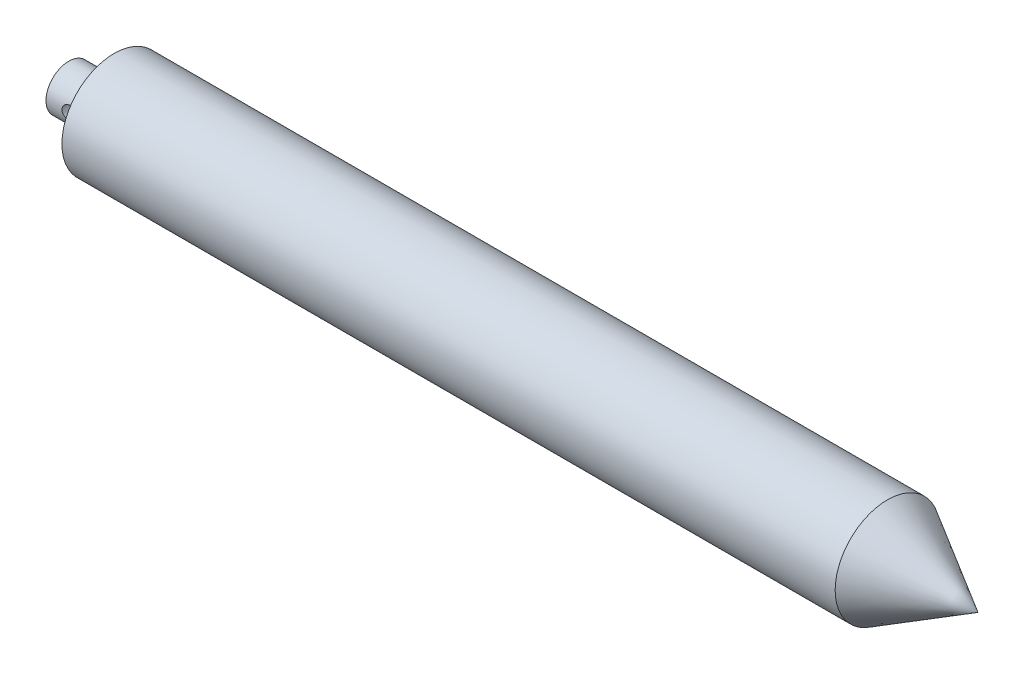
ISO-10303-21;
HEADER;
FILE_DESCRIPTION(('STEP AP214'),'2;1');
FILE_NAME('part.step','',(''),(''),'','','');
FILE_SCHEMA(('AUTOMOTIVE_DESIGN { 1 0 10303 214 1 1 1 1 }'));
ENDSEC;
DATA;
#1=APPLICATION_CONTEXT('core data for automotive mechanical design processes');
#2=APPLICATION_PROTOCOL_DEFINITION('international standard','automotive_design',2000,#1);
#3=PRODUCT_CONTEXT('',#1,'mechanical');
#4=PRODUCT('Part','Part','',(#3));
#5=PRODUCT_RELATED_PRODUCT_CATEGORY('part','',(#4));
#6=PRODUCT_DEFINITION_FORMATION('','',#4);
#7=PRODUCT_DEFINITION_CONTEXT('part definition',#1,'design');
#8=PRODUCT_DEFINITION('design','',#6,#7);
#9=PRODUCT_DEFINITION_SHAPE('','',#8);
#10=(LENGTH_UNIT() NAMED_UNIT(*) SI_UNIT(.MILLI.,.METRE.));
#11=(NAMED_UNIT(*) PLANE_ANGLE_UNIT() SI_UNIT($,.RADIAN.));
#12=(NAMED_UNIT(*) SI_UNIT($,.STERADIAN.) SOLID_ANGLE_UNIT());
#13=UNCERTAINTY_MEASURE_WITH_UNIT(LENGTH_MEASURE(1.E-05),#10,'distance_accuracy_value','');
#14=(GEOMETRIC_REPRESENTATION_CONTEXT(3) GLOBAL_UNCERTAINTY_ASSIGNED_CONTEXT((#13)) GLOBAL_UNIT_ASSIGNED_CONTEXT((#10,
#11,#12)) REPRESENTATION_CONTEXT('',''));
#15=CARTESIAN_POINT('',(0.,0.,0.));
#16=DIRECTION('',(0.,0.,1.));
#17=DIRECTION('',(1.,0.,0.));
#18=AXIS2_PLACEMENT_3D('',#15,#16,#17);
#19=CARTESIAN_POINT('',(200.,0.,0.));
#20=DIRECTION('',(-1.,0.,0.));
#21=DIRECTION('',(0.,0.,1.));
#22=AXIS2_PLACEMENT_3D('',#19,#20,#21);
#23=CONICAL_SURFACE('',#22,0.,0.523598775598299);
#24=CARTESIAN_POINT('',(180.081415712958,0.,0.));
#25=DIRECTION('',(-1.,0.,0.));
#26=DIRECTION('',(0.,0.,1.));
#27=AXIS2_PLACEMENT_3D('',#24,#25,#26);
#28=CIRCLE('',#27,11.5);
#29=CARTESIAN_POINT('',(180.081415712958,0.,11.5));
#30=VERTEX_POINT('',#29);
#31=EDGE_CURVE('E52',#30,#30,#28,.T.);
#32=ORIENTED_EDGE('',*,*,#31,.F.);
#33=EDGE_LOOP('',(#32));
#34=FACE_BOUND('',#33,.T.);
#35=CARTESIAN_POINT('',(200.,0.,0.));
#36=VERTEX_POINT('',#35);
#37=VERTEX_LOOP('',#36);
#38=FACE_BOUND('',#37,.T.);
#39=ADVANCED_FACE('F39',(#34,#38),#23,.T.);
#40=CARTESIAN_POINT('',(0.,0.,0.));
#41=DIRECTION('',(-1.,0.,0.));
#42=DIRECTION('',(0.,0.,1.));
#43=AXIS2_PLACEMENT_3D('',#40,#41,#42);
#44=CYLINDRICAL_SURFACE('',#43,11.5);
#45=CARTESIAN_POINT('',(10.,0.,0.));
#46=DIRECTION('',(-1.,0.,0.));
#47=DIRECTION('',(0.,0.,1.));
#48=AXIS2_PLACEMENT_3D('',#45,#46,#47);
#49=CIRCLE('',#48,11.5);
#50=CARTESIAN_POINT('',(10.,0.,11.5));
#51=VERTEX_POINT('',#50);
#52=EDGE_CURVE('E67',#51,#51,#49,.T.);
#53=ORIENTED_EDGE('',*,*,#52,.F.);
#54=EDGE_LOOP('',(#53));
#55=FACE_BOUND('',#54,.T.);
#56=ORIENTED_EDGE('',*,*,#31,.T.);
#57=EDGE_LOOP('',(#56));
#58=FACE_BOUND('',#57,.T.);
#59=ADVANCED_FACE('F56',(#55,#58),#44,.T.);
#60=CARTESIAN_POINT('',(10.,5.,0.));
#61=DIRECTION('',(1.,0.,0.));
#62=DIRECTION('',(0.,0.,-1.));
#63=AXIS2_PLACEMENT_3D('',#60,#61,#62);
#64=PLANE('',#63);
#65=CARTESIAN_POINT('',(10.,0.,0.));
#66=DIRECTION('',(-1.,0.,0.));
#67=DIRECTION('',(0.,0.,1.));
#68=AXIS2_PLACEMENT_3D('',#65,#66,#67);
#69=CIRCLE('',#68,5.);
#70=CARTESIAN_POINT('',(10.,0.,5.));
#71=VERTEX_POINT('',#70);
#72=EDGE_CURVE('E71',#71,#71,#69,.T.);
#73=ORIENTED_EDGE('',*,*,#72,.F.);
#74=EDGE_LOOP('',(#73));
#75=FACE_BOUND('',#74,.T.);
#76=ORIENTED_EDGE('',*,*,#52,.T.);
#77=EDGE_LOOP('',(#76));
#78=FACE_BOUND('',#77,.T.);
#79=ADVANCED_FACE('F61',(#75,#78),#64,.F.);
#80=CARTESIAN_POINT('',(0.,0.,0.));
#81=DIRECTION('',(-1.,0.,0.));
#82=DIRECTION('',(0.,0.,1.));
#83=AXIS2_PLACEMENT_3D('',#80,#81,#82);
#84=CYLINDRICAL_SURFACE('',#83,5.);
#85=CARTESIAN_POINT('',(6.5,0.,-5.));
#86=CARTESIAN_POINT('',(6.49999900251511,0.0822886127532999,-4.9999992925055));
#87=CARTESIAN_POINT('',(6.49320613637603,0.164587318351529,-4.99794915693954));
#88=CARTESIAN_POINT('',(6.4662786457779,0.326788125304881,-4.98997105593691));
#89=CARTESIAN_POINT('',(6.44614004197666,0.40668950441142,-4.98404193389692));
#90=CARTESIAN_POINT('',(6.39325398308974,0.561732707754527,-4.96895552501836));
#91=CARTESIAN_POINT('',(6.36052513038106,0.636881364395373,-4.95980300250425));
#92=CARTESIAN_POINT('',(6.28346390694416,0.780624181053131,-4.93922109237645));
#93=CARTESIAN_POINT('',(6.23912999260458,0.849217467469669,-4.92779140192067));
#94=CARTESIAN_POINT('',(6.13877599252733,0.979871797183745,-4.90350737192774));
#95=CARTESIAN_POINT('',(6.08248337411409,1.04171807124434,-4.89062383657036));
#96=CARTESIAN_POINT('',(5.96039077008982,1.15524920923324,-4.86505834210442));
#97=CARTESIAN_POINT('',(5.89458918787504,1.20693236327441,-4.85237641724501));
#98=CARTESIAN_POINT('',(5.75352924696239,1.29980037723708,-4.82834113993772));
#99=CARTESIAN_POINT('',(5.67809153900926,1.34072309022214,-4.81702406663875));
#100=CARTESIAN_POINT('',(5.52101074576971,1.4092139477476,-4.79743620394031));
#101=CARTESIAN_POINT('',(5.43936915607203,1.43678529919973,-4.78916468313311));
#102=CARTESIAN_POINT('',(5.27460973386954,1.47701633682652,-4.77690870838434));
#103=CARTESIAN_POINT('',(5.19159725613606,1.49007196234677,-4.77281069324533));
#104=CARTESIAN_POINT('',(5.02446684378323,1.50213730614672,-4.76902789749767));
#105=CARTESIAN_POINT('',(4.94034918194091,1.50115042761078,-4.76934204760571));
#106=CARTESIAN_POINT('',(4.77661609139152,1.48546977199812,-4.77424744067778));
#107=CARTESIAN_POINT('',(4.69694774963776,1.47127205262685,-4.7786838859914));
#108=CARTESIAN_POINT('',(4.54118021372654,1.43037420427056,-4.79108356228624));
#109=CARTESIAN_POINT('',(4.46508137262567,1.40367284141641,-4.79904714132351));
#110=CARTESIAN_POINT('',(4.31739965033926,1.33816026653682,-4.81772733074973));
#111=CARTESIAN_POINT('',(4.24589291604474,1.29918816934643,-4.82848016115952));
#112=CARTESIAN_POINT('',(4.11026797798981,1.21035222588683,-4.85150987000065));
#113=CARTESIAN_POINT('',(4.04615157058622,1.16048574002588,-4.86378711746991));
#114=CARTESIAN_POINT('',(3.92431380923798,1.04881290765546,-4.88911011297937));
#115=CARTESIAN_POINT('',(3.86697133597033,0.986594907466972,-4.90216654310498));
#116=CARTESIAN_POINT('',(3.76344601593575,0.853263259313967,-4.92712244063259));
#117=CARTESIAN_POINT('',(3.71726387158557,0.782149051860888,-4.9390218351841));
#118=CARTESIAN_POINT('',(3.63714007753527,0.632355038342803,-4.9604316006947));
#119=CARTESIAN_POINT('',(3.60328248375014,0.553627749747951,-4.96992543668314));
#120=CARTESIAN_POINT('',(3.54940040990037,0.391245415603519,-4.98533521832222));
#121=CARTESIAN_POINT('',(3.52937207146751,0.307591751589582,-4.99125216186999));
#122=CARTESIAN_POINT('',(3.50434782210061,0.140952242668332,-4.99868364643538));
#123=CARTESIAN_POINT('',(3.49883841419839,0.058050097601187,-5.0003485041779));
#124=CARTESIAN_POINT('',(3.50156915571208,-0.107499605823383,-4.9995292324176));
#125=CARTESIAN_POINT('',(3.50980746965144,-0.190147196690781,-4.99704565677756));
#126=CARTESIAN_POINT('',(3.5393846111115,-0.350903605309697,-4.98830696987163));
#127=CARTESIAN_POINT('',(3.56042338758087,-0.429072772614169,-4.98213829799417));
#128=CARTESIAN_POINT('',(3.6146432327782,-0.580754638954522,-4.96674347841533));
#129=CARTESIAN_POINT('',(3.64782576103786,-0.654266777025584,-4.95751696321085));
#130=CARTESIAN_POINT('',(3.72625316548113,-0.796437189461052,-4.93669654351325));
#131=CARTESIAN_POINT('',(3.77175934094797,-0.86494382619967,-4.92505280829675));
#132=CARTESIAN_POINT('',(3.87322475405281,-0.993523307980147,-4.90073468764318));
#133=CARTESIAN_POINT('',(3.92918661188767,-1.05359403235593,-4.8880600443108));
#134=CARTESIAN_POINT('',(4.05238730836934,-1.16585744551027,-4.86253171869138));
#135=CARTESIAN_POINT('',(4.11996187577174,-1.21768481231504,-4.84968825033268));
#136=CARTESIAN_POINT('',(4.26312793901353,-1.30928995072154,-4.82576515238463));
#137=CARTESIAN_POINT('',(4.33871922455821,-1.34906803829472,-4.81468547654651));
#138=CARTESIAN_POINT('',(4.49553249125469,-1.41517347127168,-4.79567189615055));
#139=CARTESIAN_POINT('',(4.57672618653659,-1.4415634693705,-4.78772337843827));
#140=CARTESIAN_POINT('',(4.74268796893148,-1.48021730815114,-4.77591594362794));
#141=CARTESIAN_POINT('',(4.82745482078767,-1.49248598978779,-4.772055625083));
#142=CARTESIAN_POINT('',(4.99436151837623,-1.50221984485059,-4.76899972496087));
#143=CARTESIAN_POINT('',(5.07646365101759,-1.5002805530849,-4.76961647442754));
#144=CARTESIAN_POINT('',(5.2391141033728,-1.48307505444813,-4.77499401288294));
#145=CARTESIAN_POINT('',(5.31966248517635,-1.46780938124716,-4.77975463592551));
#146=CARTESIAN_POINT('',(5.47594539914285,-1.42476888804136,-4.79275763670386));
#147=CARTESIAN_POINT('',(5.55172728736169,-1.39715175507068,-4.80095604545965));
#148=CARTESIAN_POINT('',(5.69764243881772,-1.33031507121129,-4.81990278909136));
#149=CARTESIAN_POINT('',(5.76777461764076,-1.29109329962876,-4.83065161194312));
#150=CARTESIAN_POINT('',(5.90316311652711,-1.20048763805072,-4.85397676425833));
#151=CARTESIAN_POINT('',(5.96814876126041,-1.14871276092994,-4.86660540163798));
#152=CARTESIAN_POINT('',(6.08870249830786,-1.03517434629782,-4.89201320450026));
#153=CARTESIAN_POINT('',(6.14426813946776,-0.973408217134502,-4.90479240823905));
#154=CARTESIAN_POINT('',(6.24602341229503,-0.839465762183249,-4.92950936570649));
#155=CARTESIAN_POINT('',(6.29189144685549,-0.767037885790608,-4.94141159765674));
#156=CARTESIAN_POINT('',(6.37073516990403,-0.61514137398353,-4.96260680455813));
#157=CARTESIAN_POINT('',(6.40371688827451,-0.535676052998956,-4.97190099931067));
#158=CARTESIAN_POINT('',(6.45289527565275,-0.380757712655282,-4.98602174969301));
#159=CARTESIAN_POINT('',(6.47051167288325,-0.305786961954235,-4.99122027381068));
#160=CARTESIAN_POINT('',(6.49406352524158,-0.15388019523078,-4.99820944494492));
#161=CARTESIAN_POINT('',(6.50000093270482,-0.0769445098581396,-5.0000006615474));
#162=CARTESIAN_POINT('',(6.5,0.,-5.));
#163=B_SPLINE_CURVE_WITH_KNOTS('',3,(#85,#86,#87,#88,#89,#90,#91,#92,#93,#94,#95,#96,#97,#98,
#99,#100,#101,#102,#103,#104,#105,#106,#107,#108,#109,#110,#111,#112,#113,#114,#115,#116,#117,
#118,#119,#120,#121,#122,#123,#124,#125,#126,#127,#128,#129,#130,#131,#132,#133,#134,#135,#136,
#137,#138,#139,#140,#141,#142,#143,#144,#145,#146,#147,#148,#149,#150,#151,#152,#153,#154,#155,
#156,#157,#158,#159,#160,#161,#162),.UNSPECIFIED.,.T.,.F.,(4,2,2,2,2,2,2,2,2,2,2,2,2,2,2,2,2,2,
2,2,2,2,2,2,2,2,2,2,2,2,2,2,2,2,2,2,2,2,4),(0.,0.246583203612611,0.493239964846,
0.739533676300874,0.985860164412702,1.23855602948192,1.49129437288633,1.74971481004109,
2.00807314543224,2.25919689356599,2.51025978319089,2.75226016697676,2.99428443658001,
3.2396242644712,3.48502360158556,3.74067104048167,3.99633456531072,4.25371046881689,
4.51101453528808,4.75908809438545,5.00712853550327,5.24956746682327,5.49203554593729,
5.74011305702908,5.98825282000191,6.24540400322819,6.50254844252681,6.75847814951252,
7.01432009460283,7.25950155466943,7.504673196616,7.74680040402721,7.98897397553107,
8.23996925679931,8.49102974897503,8.74942996156671,9.00770911595235,9.2383169193046,
9.46888616948875),.UNSPECIFIED.);
#164=CARTESIAN_POINT('',(6.5,0.,-5.));
#165=VERTEX_POINT('',#164);
#166=EDGE_CURVE('E42',#165,#165,#163,.T.);
#167=ORIENTED_EDGE('',*,*,#166,.T.);
#168=EDGE_LOOP('',(#167));
#169=FACE_BOUND('',#168,.T.);
#170=CARTESIAN_POINT('',(6.5,0.,5.));
#171=CARTESIAN_POINT('',(6.49999900251511,-0.0822886127533,4.9999992925055));
#172=CARTESIAN_POINT('',(6.49320613637603,-0.164587318351529,4.99794915693954));
#173=CARTESIAN_POINT('',(6.4662786457779,-0.326788125304881,4.98997105593691));
#174=CARTESIAN_POINT('',(6.44614004197666,-0.40668950441142,4.98404193389692));
#175=CARTESIAN_POINT('',(6.39325398308974,-0.561732707754526,4.96895552501836));
#176=CARTESIAN_POINT('',(6.36052513038106,-0.636881364395373,4.95980300250425));
#177=CARTESIAN_POINT('',(6.28346390694416,-0.780624181053131,4.93922109237645));
#178=CARTESIAN_POINT('',(6.23912999260458,-0.849217467469669,4.92779140192067));
#179=CARTESIAN_POINT('',(6.13877599252733,-0.979871797183745,4.90350737192774));
#180=CARTESIAN_POINT('',(6.08248337411409,-1.04171807124434,4.89062383657036));
#181=CARTESIAN_POINT('',(5.96039077008982,-1.15524920923324,4.86505834210442));
#182=CARTESIAN_POINT('',(5.89458918787504,-1.20693236327441,4.85237641724501));
#183=CARTESIAN_POINT('',(5.75352924696239,-1.29980037723708,4.82834113993772));
#184=CARTESIAN_POINT('',(5.67809153900926,-1.34072309022213,4.81702406663875));
#185=CARTESIAN_POINT('',(5.52101074576971,-1.4092139477476,4.79743620394031));
#186=CARTESIAN_POINT('',(5.43936915607203,-1.43678529919973,4.78916468313311));
#187=CARTESIAN_POINT('',(5.27460973386954,-1.47701633682652,4.77690870838434));
#188=CARTESIAN_POINT('',(5.19159725613606,-1.49007196234677,4.77281069324533));
#189=CARTESIAN_POINT('',(5.02446684378323,-1.50213730614672,4.76902789749767));
#190=CARTESIAN_POINT('',(4.94034918194091,-1.50115042761078,4.76934204760571));
#191=CARTESIAN_POINT('',(4.77661609139152,-1.48546977199812,4.77424744067778));
#192=CARTESIAN_POINT('',(4.69694774963776,-1.47127205262685,4.7786838859914));
#193=CARTESIAN_POINT('',(4.54118021372654,-1.43037420427056,4.79108356228624));
#194=CARTESIAN_POINT('',(4.46508137262567,-1.40367284141641,4.79904714132351));
#195=CARTESIAN_POINT('',(4.31739965033926,-1.33816026653682,4.81772733074973));
#196=CARTESIAN_POINT('',(4.24589291604474,-1.29918816934643,4.82848016115952));
#197=CARTESIAN_POINT('',(4.11026797798981,-1.21035222588683,4.85150987000065));
#198=CARTESIAN_POINT('',(4.04615157058622,-1.16048574002588,4.86378711746991));
#199=CARTESIAN_POINT('',(3.92431380923798,-1.04881290765546,4.88911011297937));
#200=CARTESIAN_POINT('',(3.86697133597033,-0.986594907466973,4.90216654310498));
#201=CARTESIAN_POINT('',(3.76344601593575,-0.853263259313968,4.92712244063259));
#202=CARTESIAN_POINT('',(3.71726387158557,-0.782149051860888,4.9390218351841));
#203=CARTESIAN_POINT('',(3.63714007753527,-0.632355038342804,4.9604316006947));
#204=CARTESIAN_POINT('',(3.60328248375014,-0.553627749747951,4.96992543668314));
#205=CARTESIAN_POINT('',(3.54940040990037,-0.39124541560352,4.98533521832222));
#206=CARTESIAN_POINT('',(3.52937207146751,-0.307591751589582,4.99125216186999));
#207=CARTESIAN_POINT('',(3.50434782210061,-0.140952242668332,4.99868364643538));
#208=CARTESIAN_POINT('',(3.49883841419839,-0.0580500976011876,5.0003485041779));
#209=CARTESIAN_POINT('',(3.50156915571208,0.107499605823382,4.9995292324176));
#210=CARTESIAN_POINT('',(3.50980746965144,0.19014719669078,4.99704565677756));
#211=CARTESIAN_POINT('',(3.5393846111115,0.350903605309696,4.98830696987163));
#212=CARTESIAN_POINT('',(3.56042338758087,0.429072772614169,4.98213829799417));
#213=CARTESIAN_POINT('',(3.6146432327782,0.580754638954521,4.96674347841533));
#214=CARTESIAN_POINT('',(3.64782576103786,0.654266777025583,4.95751696321085));
#215=CARTESIAN_POINT('',(3.72625316548113,0.796437189461052,4.93669654351325));
#216=CARTESIAN_POINT('',(3.77175934094797,0.86494382619967,4.92505280829675));
#217=CARTESIAN_POINT('',(3.87322475405281,0.993523307980147,4.90073468764318));
#218=CARTESIAN_POINT('',(3.92918661188767,1.05359403235593,4.8880600443108));
#219=CARTESIAN_POINT('',(4.05238730836934,1.16585744551027,4.86253171869138));
#220=CARTESIAN_POINT('',(4.11996187577174,1.21768481231503,4.84968825033268));
#221=CARTESIAN_POINT('',(4.26312793901353,1.30928995072154,4.82576515238464));
#222=CARTESIAN_POINT('',(4.33871922455821,1.34906803829472,4.81468547654651));
#223=CARTESIAN_POINT('',(4.49553249125469,1.41517347127168,4.79567189615055));
#224=CARTESIAN_POINT('',(4.57672618653659,1.4415634693705,4.78772337843827));
#225=CARTESIAN_POINT('',(4.74268796893148,1.48021730815114,4.77591594362794));
#226=CARTESIAN_POINT('',(4.82745482078767,1.49248598978779,4.772055625083));
#227=CARTESIAN_POINT('',(4.99436151837623,1.50221984485059,4.76899972496087));
#228=CARTESIAN_POINT('',(5.07646365101759,1.5002805530849,4.76961647442754));
#229=CARTESIAN_POINT('',(5.2391141033728,1.48307505444813,4.77499401288294));
#230=CARTESIAN_POINT('',(5.31966248517635,1.46780938124716,4.77975463592551));
#231=CARTESIAN_POINT('',(5.47594539914285,1.42476888804136,4.79275763670386));
#232=CARTESIAN_POINT('',(5.55172728736169,1.39715175507069,4.80095604545965));
#233=CARTESIAN_POINT('',(5.69764243881772,1.33031507121129,4.81990278909136));
#234=CARTESIAN_POINT('',(5.76777461764076,1.29109329962876,4.83065161194312));
#235=CARTESIAN_POINT('',(5.90316311652711,1.20048763805072,4.85397676425833));
#236=CARTESIAN_POINT('',(5.96814876126041,1.14871276092994,4.86660540163798));
#237=CARTESIAN_POINT('',(6.08870249830786,1.03517434629782,4.89201320450026));
#238=CARTESIAN_POINT('',(6.14426813946776,0.973408217134503,4.90479240823905));
#239=CARTESIAN_POINT('',(6.24602341229503,0.83946576218325,4.92950936570649));
#240=CARTESIAN_POINT('',(6.29189144685549,0.767037885790609,4.94141159765674));
#241=CARTESIAN_POINT('',(6.37073516990403,0.615141373983531,4.96260680455813));
#242=CARTESIAN_POINT('',(6.40371688827451,0.535676052998956,4.97190099931067));
#243=CARTESIAN_POINT('',(6.45289527565275,0.380757712655282,4.98602174969301));
#244=CARTESIAN_POINT('',(6.47051167288325,0.305786961954234,4.99122027381068));
#245=CARTESIAN_POINT('',(6.49406352524158,0.153880195230779,4.99820944494492));
#246=CARTESIAN_POINT('',(6.50000093270482,0.0769445098581394,5.0000006615474));
#247=CARTESIAN_POINT('',(6.5,0.,5.));
#248=B_SPLINE_CURVE_WITH_KNOTS('',3,(#170,#171,#172,#173,#174,#175,#176,#177,#178,#179,#180,
#181,#182,#183,#184,#185,#186,#187,#188,#189,#190,#191,#192,#193,#194,#195,#196,#197,#198,#199,
#200,#201,#202,#203,#204,#205,#206,#207,#208,#209,#210,#211,#212,#213,#214,#215,#216,#217,#218,
#219,#220,#221,#222,#223,#224,#225,#226,#227,#228,#229,#230,#231,#232,#233,#234,#235,#236,#237,
#238,#239,#240,#241,#242,#243,#244,#245,#246,#247),.UNSPECIFIED.,.T.,.F.,(4,2,2,2,2,2,2,2,2,2,2,
2,2,2,2,2,2,2,2,2,2,2,2,2,2,2,2,2,2,2,2,2,2,2,2,2,2,2,4),(0.,0.246583203612611,
0.493239964845999,0.739533676300874,0.985860164412701,1.23855602948191,1.49129437288633,
1.74971481004109,2.00807314543224,2.25919689356599,2.51025978319089,2.75226016697676,
2.99428443658001,3.23962426447119,3.48502360158555,3.74067104048167,3.99633456531072,
4.25371046881689,4.51101453528808,4.75908809438545,5.00712853550327,5.24956746682327,
5.49203554593729,5.74011305702908,5.98825282000191,6.24540400322819,6.50254844252681,
6.75847814951252,7.01432009460283,7.25950155466943,7.504673196616,7.74680040402721,
7.98897397553107,8.23996925679931,8.49102974897503,8.74942996156671,9.00770911595235,
9.2383169193046,9.46888616948875),.UNSPECIFIED.);
#249=CARTESIAN_POINT('',(6.5,0.,5.));
#250=VERTEX_POINT('',#249);
#251=EDGE_CURVE('E11',#250,#250,#248,.T.);
#252=ORIENTED_EDGE('',*,*,#251,.T.);
#253=EDGE_LOOP('',(#252));
#254=FACE_BOUND('',#253,.T.);
#255=CARTESIAN_POINT('',(0.,0.,0.));
#256=DIRECTION('',(-1.,0.,0.));
#257=DIRECTION('',(0.,0.,1.));
#258=AXIS2_PLACEMENT_3D('',#255,#256,#257);
#259=CIRCLE('',#258,5.);
#260=CARTESIAN_POINT('',(0.,0.,5.));
#261=VERTEX_POINT('',#260);
#262=EDGE_CURVE('E95',#261,#261,#259,.T.);
#263=ORIENTED_EDGE('',*,*,#262,.F.);
#264=EDGE_LOOP('',(#263));
#265=FACE_BOUND('',#264,.T.);
#266=ORIENTED_EDGE('',*,*,#72,.T.);
#267=EDGE_LOOP('',(#266));
#268=FACE_BOUND('',#267,.T.);
#269=ADVANCED_FACE('F77',(#169,#254,#265,#268),#84,.T.);
#270=CARTESIAN_POINT('',(0.,0.,0.));
#271=DIRECTION('',(1.,0.,0.));
#272=DIRECTION('',(0.,0.,-1.));
#273=AXIS2_PLACEMENT_3D('',#270,#271,#272);
#274=PLANE('',#273);
#275=ORIENTED_EDGE('',*,*,#262,.T.);
#276=EDGE_LOOP('',(#275));
#277=FACE_BOUND('',#276,.T.);
#278=ADVANCED_FACE('F84',(#277),#274,.F.);
#279=CARTESIAN_POINT('',(5.,0.,-11.5));
#280=DIRECTION('',(0.,0.,1.));
#281=DIRECTION('',(1.,0.,0.));
#282=AXIS2_PLACEMENT_3D('',#279,#280,#281);
#283=CYLINDRICAL_SURFACE('',#282,1.5);
#284=ORIENTED_EDGE('',*,*,#166,.F.);
#285=EDGE_LOOP('',(#284));
#286=FACE_BOUND('',#285,.T.);
#287=ORIENTED_EDGE('',*,*,#251,.F.);
#288=EDGE_LOOP('',(#287));
#289=FACE_BOUND('',#288,.T.);
#290=ADVANCED_FACE('F81',(#286,#289),#283,.F.);
#291=CLOSED_SHELL('',(#39,#59,#79,#269,#278,#290));
#292=MANIFOLD_SOLID_BREP('B2',#291);
#293=ADVANCED_BREP_SHAPE_REPRESENTATION('',(#18,#292),#14);
#294=SHAPE_DEFINITION_REPRESENTATION(#9,#293);
ENDSEC;
END-ISO-10303-21;
